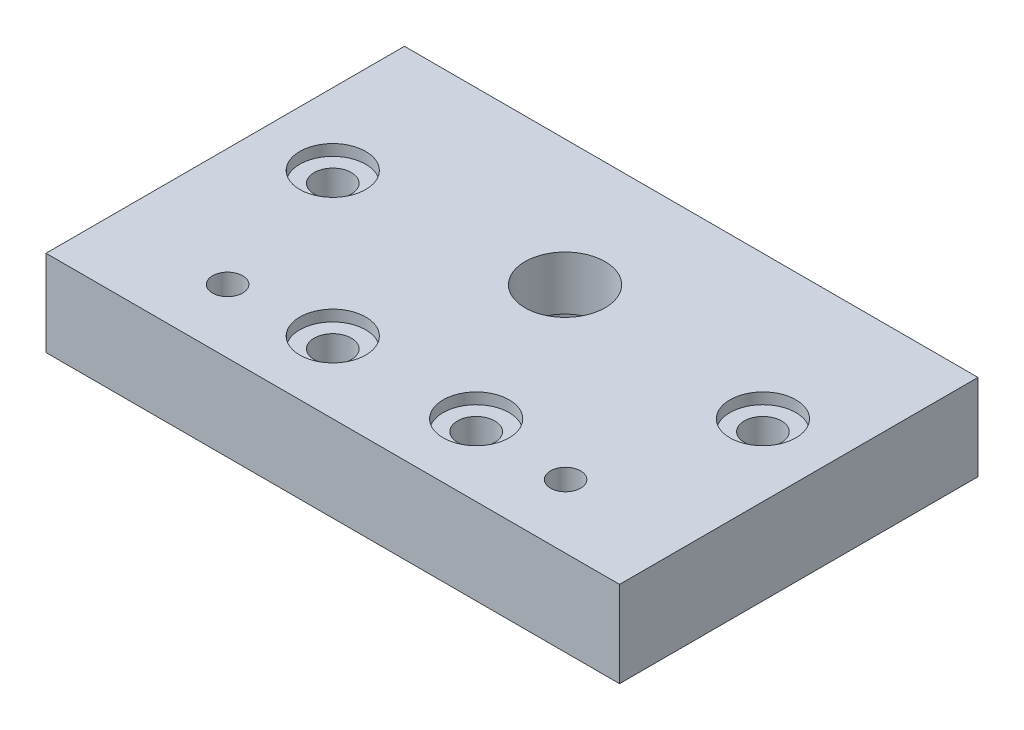
ISO-10303-21;
HEADER;
FILE_DESCRIPTION(('STEP AP214'),'2;1');
FILE_NAME('part.step','',(''),(''),'','','');
FILE_SCHEMA(('AUTOMOTIVE_DESIGN { 1 0 10303 214 1 1 1 1 }'));
ENDSEC;
DATA;
#1=APPLICATION_CONTEXT('core data for automotive mechanical design processes');
#2=APPLICATION_PROTOCOL_DEFINITION('international standard','automotive_design',2000,#1);
#3=PRODUCT_CONTEXT('',#1,'mechanical');
#4=PRODUCT('Part','Part','',(#3));
#5=PRODUCT_RELATED_PRODUCT_CATEGORY('part','',(#4));
#6=PRODUCT_DEFINITION_FORMATION('','',#4);
#7=PRODUCT_DEFINITION_CONTEXT('part definition',#1,'design');
#8=PRODUCT_DEFINITION('design','',#6,#7);
#9=PRODUCT_DEFINITION_SHAPE('','',#8);
#10=(LENGTH_UNIT() NAMED_UNIT(*) SI_UNIT(.MILLI.,.METRE.));
#11=(NAMED_UNIT(*) PLANE_ANGLE_UNIT() SI_UNIT($,.RADIAN.));
#12=(NAMED_UNIT(*) SI_UNIT($,.STERADIAN.) SOLID_ANGLE_UNIT());
#13=UNCERTAINTY_MEASURE_WITH_UNIT(LENGTH_MEASURE(1.E-05),#10,'distance_accuracy_value','');
#14=(GEOMETRIC_REPRESENTATION_CONTEXT(3) GLOBAL_UNCERTAINTY_ASSIGNED_CONTEXT((#13)) GLOBAL_UNIT_ASSIGNED_CONTEXT((#10,
#11,#12)) REPRESENTATION_CONTEXT('',''));
#15=CARTESIAN_POINT('',(0.,0.,0.));
#16=DIRECTION('',(0.,0.,1.));
#17=DIRECTION('',(1.,0.,0.));
#18=AXIS2_PLACEMENT_3D('',#15,#16,#17);
#19=CARTESIAN_POINT('',(0.,0.,0.));
#20=DIRECTION('',(0.,1.,0.));
#21=DIRECTION('',(0.,0.,1.));
#22=AXIS2_PLACEMENT_3D('',#19,#20,#21);
#23=PLANE('',#22);
#24=CARTESIAN_POINT('',(23.57,0.,16.1));
#25=DIRECTION('',(0.,1.,0.));
#26=DIRECTION('',(0.,0.,1.));
#27=AXIS2_PLACEMENT_3D('',#24,#25,#26);
#28=CIRCLE('',#27,2.09999999999999);
#29=CARTESIAN_POINT('',(23.57,0.,18.2));
#30=VERTEX_POINT('',#29);
#31=EDGE_CURVE('E128',#30,#30,#28,.T.);
#32=ORIENTED_EDGE('',*,*,#31,.T.);
#33=EDGE_LOOP('',(#32));
#34=FACE_BOUND('',#33,.T.);
#35=CARTESIAN_POINT('',(-23.57,0.,16.1));
#36=DIRECTION('',(0.,1.,0.));
#37=DIRECTION('',(0.,0.,1.));
#38=AXIS2_PLACEMENT_3D('',#35,#36,#37);
#39=CIRCLE('',#38,2.09999999999999);
#40=CARTESIAN_POINT('',(-23.57,0.,18.2));
#41=VERTEX_POINT('',#40);
#42=EDGE_CURVE('E134',#41,#41,#39,.T.);
#43=ORIENTED_EDGE('',*,*,#42,.T.);
#44=EDGE_LOOP('',(#43));
#45=FACE_BOUND('',#44,.T.);
#46=CARTESIAN_POINT('',(30.,0.,-5.));
#47=DIRECTION('',(0.,1.,0.));
#48=DIRECTION('',(0.,0.,1.));
#49=AXIS2_PLACEMENT_3D('',#46,#47,#48);
#50=CIRCLE('',#49,2.6);
#51=CARTESIAN_POINT('',(30.,0.,-2.4));
#52=VERTEX_POINT('',#51);
#53=EDGE_CURVE('E146',#52,#52,#50,.T.);
#54=ORIENTED_EDGE('',*,*,#53,.T.);
#55=EDGE_LOOP('',(#54));
#56=FACE_BOUND('',#55,.T.);
#57=CARTESIAN_POINT('',(10.,0.,15.));
#58=DIRECTION('',(0.,1.,0.));
#59=DIRECTION('',(0.,0.,1.));
#60=AXIS2_PLACEMENT_3D('',#57,#58,#59);
#61=CIRCLE('',#60,2.6);
#62=CARTESIAN_POINT('',(10.,0.,17.6));
#63=VERTEX_POINT('',#62);
#64=EDGE_CURVE('E158',#63,#63,#61,.T.);
#65=ORIENTED_EDGE('',*,*,#64,.T.);
#66=EDGE_LOOP('',(#65));
#67=FACE_BOUND('',#66,.T.);
#68=CARTESIAN_POINT('',(-30.,0.,-5.));
#69=DIRECTION('',(0.,1.,0.));
#70=DIRECTION('',(0.,0.,1.));
#71=AXIS2_PLACEMENT_3D('',#68,#69,#70);
#72=CIRCLE('',#71,2.6);
#73=CARTESIAN_POINT('',(-30.,0.,-2.4));
#74=VERTEX_POINT('',#73);
#75=EDGE_CURVE('E170',#74,#74,#72,.T.);
#76=ORIENTED_EDGE('',*,*,#75,.T.);
#77=EDGE_LOOP('',(#76));
#78=FACE_BOUND('',#77,.T.);
#79=CARTESIAN_POINT('',(-10.,0.,15.));
#80=DIRECTION('',(0.,1.,0.));
#81=DIRECTION('',(0.,0.,1.));
#82=AXIS2_PLACEMENT_3D('',#79,#80,#81);
#83=CIRCLE('',#82,2.6);
#84=CARTESIAN_POINT('',(-10.,0.,17.6));
#85=VERTEX_POINT('',#84);
#86=EDGE_CURVE('E182',#85,#85,#83,.T.);
#87=ORIENTED_EDGE('',*,*,#86,.T.);
#88=EDGE_LOOP('',(#87));
#89=FACE_BOUND('',#88,.T.);
#90=DIRECTION('',(0.,0.,-1.));
#91=VECTOR('',#90,1.);
#92=CARTESIAN_POINT('',(40.,0.,-25.));
#93=LINE('',#92,#91);
#94=CARTESIAN_POINT('',(40.,0.,25.));
#95=VERTEX_POINT('',#94);
#96=CARTESIAN_POINT('',(40.,0.,-25.));
#97=VERTEX_POINT('',#96);
#98=EDGE_CURVE('E185',#95,#97,#93,.T.);
#99=ORIENTED_EDGE('',*,*,#98,.F.);
#100=DIRECTION('',(1.,0.,0.));
#101=VECTOR('',#100,1.);
#102=CARTESIAN_POINT('',(-40.,0.,25.));
#103=LINE('',#102,#101);
#104=CARTESIAN_POINT('',(-40.,0.,25.));
#105=VERTEX_POINT('',#104);
#106=EDGE_CURVE('E78',#105,#95,#103,.T.);
#107=ORIENTED_EDGE('',*,*,#106,.F.);
#108=DIRECTION('',(0.,0.,1.));
#109=VECTOR('',#108,1.);
#110=CARTESIAN_POINT('',(-40.,0.,-25.));
#111=LINE('',#110,#109);
#112=CARTESIAN_POINT('',(-40.,0.,-25.));
#113=VERTEX_POINT('',#112);
#114=EDGE_CURVE('E72',#113,#105,#111,.T.);
#115=ORIENTED_EDGE('',*,*,#114,.F.);
#116=DIRECTION('',(-1.,0.,0.));
#117=VECTOR('',#116,1.);
#118=CARTESIAN_POINT('',(-40.,0.,-25.));
#119=LINE('',#118,#117);
#120=EDGE_CURVE('E195',#97,#113,#119,.T.);
#121=ORIENTED_EDGE('',*,*,#120,.F.);
#122=EDGE_LOOP('',(#99,#107,#115,#121));
#123=FACE_BOUND('',#122,.T.);
#124=CARTESIAN_POINT('',(0.,0.,-7.4));
#125=DIRECTION('',(0.,-1.,0.));
#126=DIRECTION('',(0.,0.,-1.));
#127=AXIS2_PLACEMENT_3D('',#124,#125,#126);
#128=CIRCLE('',#127,8.05);
#129=CARTESIAN_POINT('',(0.,0.,-15.45));
#130=VERTEX_POINT('',#129);
#131=EDGE_CURVE('E113',#130,#130,#128,.T.);
#132=ORIENTED_EDGE('',*,*,#131,.F.);
#133=EDGE_LOOP('',(#132));
#134=FACE_BOUND('',#133,.T.);
#135=ADVANCED_FACE('F37',(#34,#45,#56,#67,#78,#89,#123,#134),#23,.F.);
#136=CARTESIAN_POINT('',(40.,12.,-25.));
#137=DIRECTION('',(-1.,0.,0.));
#138=DIRECTION('',(0.,0.,1.));
#139=AXIS2_PLACEMENT_3D('',#136,#137,#138);
#140=PLANE('',#139);
#141=ORIENTED_EDGE('',*,*,#98,.T.);
#142=DIRECTION('',(0.,-1.,0.));
#143=VECTOR('',#142,1.);
#144=CARTESIAN_POINT('',(40.,12.,-25.));
#145=LINE('',#144,#143);
#146=CARTESIAN_POINT('',(40.,12.,-25.));
#147=VERTEX_POINT('',#146);
#148=EDGE_CURVE('E11',#147,#97,#145,.T.);
#149=ORIENTED_EDGE('',*,*,#148,.F.);
#150=DIRECTION('',(0.,0.,-1.));
#151=VECTOR('',#150,1.);
#152=CARTESIAN_POINT('',(40.,12.,-25.));
#153=LINE('',#152,#151);
#154=CARTESIAN_POINT('',(40.,12.,25.));
#155=VERTEX_POINT('',#154);
#156=EDGE_CURVE('E186',#155,#147,#153,.T.);
#157=ORIENTED_EDGE('',*,*,#156,.F.);
#158=DIRECTION('',(0.,-1.,0.));
#159=VECTOR('',#158,1.);
#160=CARTESIAN_POINT('',(40.,12.,25.));
#161=LINE('',#160,#159);
#162=EDGE_CURVE('E192',#155,#95,#161,.T.);
#163=ORIENTED_EDGE('',*,*,#162,.T.);
#164=EDGE_LOOP('',(#141,#149,#157,#163));
#165=FACE_BOUND('',#164,.T.);
#166=ADVANCED_FACE('F39',(#165),#140,.F.);
#167=CARTESIAN_POINT('',(-40.,12.,-25.));
#168=DIRECTION('',(0.,0.,1.));
#169=DIRECTION('',(1.,0.,0.));
#170=AXIS2_PLACEMENT_3D('',#167,#168,#169);
#171=PLANE('',#170);
#172=CARTESIAN_POINT('',(-9.99999999999999,6.,-25.));
#173=DIRECTION('',(0.,0.,-1.));
#174=DIRECTION('',(-1.,0.,0.));
#175=AXIS2_PLACEMENT_3D('',#172,#173,#174);
#176=CIRCLE('',#175,2.09999999999999);
#177=CARTESIAN_POINT('',(-12.1,6.,-25.));
#178=VERTEX_POINT('',#177);
#179=EDGE_CURVE('E103',#178,#178,#176,.T.);
#180=ORIENTED_EDGE('',*,*,#179,.F.);
#181=EDGE_LOOP('',(#180));
#182=FACE_BOUND('',#181,.T.);
#183=CARTESIAN_POINT('',(9.99999999999999,6.,-25.));
#184=DIRECTION('',(0.,0.,-1.));
#185=DIRECTION('',(-1.,0.,0.));
#186=AXIS2_PLACEMENT_3D('',#183,#184,#185);
#187=CIRCLE('',#186,2.09999999999999);
#188=CARTESIAN_POINT('',(7.9,6.,-25.));
#189=VERTEX_POINT('',#188);
#190=EDGE_CURVE('E102',#189,#189,#187,.T.);
#191=ORIENTED_EDGE('',*,*,#190,.F.);
#192=EDGE_LOOP('',(#191));
#193=FACE_BOUND('',#192,.T.);
#194=ORIENTED_EDGE('',*,*,#120,.T.);
#195=DIRECTION('',(0.,-1.,0.));
#196=VECTOR('',#195,1.);
#197=CARTESIAN_POINT('',(-40.,12.,-25.));
#198=LINE('',#197,#196);
#199=CARTESIAN_POINT('',(-40.,12.,-25.));
#200=VERTEX_POINT('',#199);
#201=EDGE_CURVE('E46',#200,#113,#198,.T.);
#202=ORIENTED_EDGE('',*,*,#201,.F.);
#203=DIRECTION('',(-1.,0.,0.));
#204=VECTOR('',#203,1.);
#205=CARTESIAN_POINT('',(-40.,12.,-25.));
#206=LINE('',#205,#204);
#207=EDGE_CURVE('E85',#147,#200,#206,.T.);
#208=ORIENTED_EDGE('',*,*,#207,.F.);
#209=ORIENTED_EDGE('',*,*,#148,.T.);
#210=EDGE_LOOP('',(#194,#202,#208,#209));
#211=FACE_BOUND('',#210,.T.);
#212=ADVANCED_FACE('F221',(#182,#193,#211),#171,.F.);
#213=CARTESIAN_POINT('',(-40.,12.,-25.));
#214=DIRECTION('',(1.,0.,0.));
#215=DIRECTION('',(0.,0.,-1.));
#216=AXIS2_PLACEMENT_3D('',#213,#214,#215);
#217=PLANE('',#216);
#218=ORIENTED_EDGE('',*,*,#114,.T.);
#219=DIRECTION('',(0.,-1.,0.));
#220=VECTOR('',#219,1.);
#221=CARTESIAN_POINT('',(-40.,12.,25.));
#222=LINE('',#221,#220);
#223=CARTESIAN_POINT('',(-40.,12.,25.));
#224=VERTEX_POINT('',#223);
#225=EDGE_CURVE('E200',#224,#105,#222,.T.);
#226=ORIENTED_EDGE('',*,*,#225,.F.);
#227=DIRECTION('',(0.,0.,1.));
#228=VECTOR('',#227,1.);
#229=CARTESIAN_POINT('',(-40.,12.,-25.));
#230=LINE('',#229,#228);
#231=EDGE_CURVE('E189',#200,#224,#230,.T.);
#232=ORIENTED_EDGE('',*,*,#231,.F.);
#233=ORIENTED_EDGE('',*,*,#201,.T.);
#234=EDGE_LOOP('',(#218,#226,#232,#233));
#235=FACE_BOUND('',#234,.T.);
#236=ADVANCED_FACE('F202',(#235),#217,.F.);
#237=CARTESIAN_POINT('',(-40.,12.,25.));
#238=DIRECTION('',(0.,0.,-1.));
#239=DIRECTION('',(-1.,0.,0.));
#240=AXIS2_PLACEMENT_3D('',#237,#238,#239);
#241=PLANE('',#240);
#242=ORIENTED_EDGE('',*,*,#106,.T.);
#243=ORIENTED_EDGE('',*,*,#162,.F.);
#244=DIRECTION('',(1.,0.,0.));
#245=VECTOR('',#244,1.);
#246=CARTESIAN_POINT('',(-40.,12.,25.));
#247=LINE('',#246,#245);
#248=EDGE_CURVE('E54',#224,#155,#247,.T.);
#249=ORIENTED_EDGE('',*,*,#248,.F.);
#250=ORIENTED_EDGE('',*,*,#225,.T.);
#251=EDGE_LOOP('',(#242,#243,#249,#250));
#252=FACE_BOUND('',#251,.T.);
#253=ADVANCED_FACE('F209',(#252),#241,.F.);
#254=CARTESIAN_POINT('',(0.,12.,0.));
#255=DIRECTION('',(0.,1.,0.));
#256=DIRECTION('',(0.,0.,1.));
#257=AXIS2_PLACEMENT_3D('',#254,#255,#256);
#258=PLANE('',#257);
#259=CARTESIAN_POINT('',(0.,12.,-7.4));
#260=DIRECTION('',(0.,-1.,0.));
#261=DIRECTION('',(0.,0.,-1.));
#262=AXIS2_PLACEMENT_3D('',#259,#260,#261);
#263=CIRCLE('',#262,5.58800000000001);
#264=CARTESIAN_POINT('',(0.,12.,-12.988));
#265=VERTEX_POINT('',#264);
#266=EDGE_CURVE('E122',#265,#265,#263,.T.);
#267=ORIENTED_EDGE('',*,*,#266,.T.);
#268=EDGE_LOOP('',(#267));
#269=FACE_BOUND('',#268,.T.);
#270=CARTESIAN_POINT('',(23.57,12.,16.1));
#271=DIRECTION('',(0.,1.,0.));
#272=DIRECTION('',(0.,0.,1.));
#273=AXIS2_PLACEMENT_3D('',#270,#271,#272);
#274=CIRCLE('',#273,2.09999999999999);
#275=CARTESIAN_POINT('',(23.57,12.,18.2));
#276=VERTEX_POINT('',#275);
#277=EDGE_CURVE('E125',#276,#276,#274,.T.);
#278=ORIENTED_EDGE('',*,*,#277,.F.);
#279=EDGE_LOOP('',(#278));
#280=FACE_BOUND('',#279,.T.);
#281=CARTESIAN_POINT('',(-23.57,12.,16.1));
#282=DIRECTION('',(0.,1.,0.));
#283=DIRECTION('',(0.,0.,1.));
#284=AXIS2_PLACEMENT_3D('',#281,#282,#283);
#285=CIRCLE('',#284,2.09999999999999);
#286=CARTESIAN_POINT('',(-23.57,12.,18.2));
#287=VERTEX_POINT('',#286);
#288=EDGE_CURVE('E131',#287,#287,#285,.T.);
#289=ORIENTED_EDGE('',*,*,#288,.F.);
#290=EDGE_LOOP('',(#289));
#291=FACE_BOUND('',#290,.T.);
#292=CARTESIAN_POINT('',(30.,12.,-5.));
#293=DIRECTION('',(0.,1.,0.));
#294=DIRECTION('',(0.,0.,1.));
#295=AXIS2_PLACEMENT_3D('',#292,#293,#294);
#296=CIRCLE('',#295,4.6);
#297=CARTESIAN_POINT('',(30.,12.,-0.400000000000001));
#298=VERTEX_POINT('',#297);
#299=EDGE_CURVE('E137',#298,#298,#296,.T.);
#300=ORIENTED_EDGE('',*,*,#299,.F.);
#301=EDGE_LOOP('',(#300));
#302=FACE_BOUND('',#301,.T.);
#303=CARTESIAN_POINT('',(10.,12.,15.));
#304=DIRECTION('',(0.,1.,0.));
#305=DIRECTION('',(0.,0.,1.));
#306=AXIS2_PLACEMENT_3D('',#303,#304,#305);
#307=CIRCLE('',#306,4.6);
#308=CARTESIAN_POINT('',(10.,12.,19.6));
#309=VERTEX_POINT('',#308);
#310=EDGE_CURVE('E149',#309,#309,#307,.T.);
#311=ORIENTED_EDGE('',*,*,#310,.F.);
#312=EDGE_LOOP('',(#311));
#313=FACE_BOUND('',#312,.T.);
#314=CARTESIAN_POINT('',(-30.,12.,-5.));
#315=DIRECTION('',(0.,1.,0.));
#316=DIRECTION('',(0.,0.,1.));
#317=AXIS2_PLACEMENT_3D('',#314,#315,#316);
#318=CIRCLE('',#317,4.6);
#319=CARTESIAN_POINT('',(-30.,12.,-0.400000000000001));
#320=VERTEX_POINT('',#319);
#321=EDGE_CURVE('E161',#320,#320,#318,.T.);
#322=ORIENTED_EDGE('',*,*,#321,.F.);
#323=EDGE_LOOP('',(#322));
#324=FACE_BOUND('',#323,.T.);
#325=CARTESIAN_POINT('',(-10.,12.,15.));
#326=DIRECTION('',(0.,1.,0.));
#327=DIRECTION('',(0.,0.,1.));
#328=AXIS2_PLACEMENT_3D('',#325,#326,#327);
#329=CIRCLE('',#328,4.6);
#330=CARTESIAN_POINT('',(-10.,12.,19.6));
#331=VERTEX_POINT('',#330);
#332=EDGE_CURVE('E173',#331,#331,#329,.T.);
#333=ORIENTED_EDGE('',*,*,#332,.F.);
#334=EDGE_LOOP('',(#333));
#335=FACE_BOUND('',#334,.T.);
#336=ORIENTED_EDGE('',*,*,#156,.T.);
#337=ORIENTED_EDGE('',*,*,#207,.T.);
#338=ORIENTED_EDGE('',*,*,#231,.T.);
#339=ORIENTED_EDGE('',*,*,#248,.T.);
#340=EDGE_LOOP('',(#336,#337,#338,#339));
#341=FACE_BOUND('',#340,.T.);
#342=ADVANCED_FACE('F211',(#269,#280,#291,#302,#313,#324,#335,#341),#258,.T.);
#343=CARTESIAN_POINT('',(-10.,12.,15.));
#344=DIRECTION('',(0.,1.,0.));
#345=DIRECTION('',(0.,0.,1.));
#346=AXIS2_PLACEMENT_3D('',#343,#344,#345);
#347=CYLINDRICAL_SURFACE('',#346,2.6);
#348=ORIENTED_EDGE('',*,*,#86,.F.);
#349=EDGE_LOOP('',(#348));
#350=FACE_BOUND('',#349,.T.);
#351=CARTESIAN_POINT('',(-10.,10.45,15.));
#352=DIRECTION('',(0.,1.,0.));
#353=DIRECTION('',(0.,0.,1.));
#354=AXIS2_PLACEMENT_3D('',#351,#352,#353);
#355=CIRCLE('',#354,2.6);
#356=CARTESIAN_POINT('',(-10.,10.45,17.6));
#357=VERTEX_POINT('',#356);
#358=EDGE_CURVE('E179',#357,#357,#355,.T.);
#359=ORIENTED_EDGE('',*,*,#358,.T.);
#360=EDGE_LOOP('',(#359));
#361=FACE_BOUND('',#360,.T.);
#362=ADVANCED_FACE('F218',(#350,#361),#347,.F.);
#363=CARTESIAN_POINT('',(-7.40000000000001,10.45,15.));
#364=DIRECTION('',(0.,-1.,0.));
#365=DIRECTION('',(0.,0.,-1.));
#366=AXIS2_PLACEMENT_3D('',#363,#364,#365);
#367=PLANE('',#366);
#368=ORIENTED_EDGE('',*,*,#358,.F.);
#369=EDGE_LOOP('',(#368));
#370=FACE_BOUND('',#369,.T.);
#371=CARTESIAN_POINT('',(-10.,10.45,15.));
#372=DIRECTION('',(0.,1.,0.));
#373=DIRECTION('',(0.,0.,1.));
#374=AXIS2_PLACEMENT_3D('',#371,#372,#373);
#375=CIRCLE('',#374,4.6);
#376=CARTESIAN_POINT('',(-10.,10.45,19.6));
#377=VERTEX_POINT('',#376);
#378=EDGE_CURVE('E176',#377,#377,#375,.T.);
#379=ORIENTED_EDGE('',*,*,#378,.T.);
#380=EDGE_LOOP('',(#379));
#381=FACE_BOUND('',#380,.T.);
#382=ADVANCED_FACE('F233',(#370,#381),#367,.F.);
#383=CARTESIAN_POINT('',(-10.,12.,15.));
#384=DIRECTION('',(0.,1.,0.));
#385=DIRECTION('',(0.,0.,1.));
#386=AXIS2_PLACEMENT_3D('',#383,#384,#385);
#387=CYLINDRICAL_SURFACE('',#386,4.6);
#388=ORIENTED_EDGE('',*,*,#378,.F.);
#389=EDGE_LOOP('',(#388));
#390=FACE_BOUND('',#389,.T.);
#391=ORIENTED_EDGE('',*,*,#332,.T.);
#392=EDGE_LOOP('',(#391));
#393=FACE_BOUND('',#392,.T.);
#394=ADVANCED_FACE('F237',(#390,#393),#387,.F.);
#395=CARTESIAN_POINT('',(-30.,12.,-5.));
#396=DIRECTION('',(0.,1.,0.));
#397=DIRECTION('',(0.,0.,1.));
#398=AXIS2_PLACEMENT_3D('',#395,#396,#397);
#399=CYLINDRICAL_SURFACE('',#398,2.6);
#400=ORIENTED_EDGE('',*,*,#75,.F.);
#401=EDGE_LOOP('',(#400));
#402=FACE_BOUND('',#401,.T.);
#403=CARTESIAN_POINT('',(-30.,10.45,-5.));
#404=DIRECTION('',(0.,1.,0.));
#405=DIRECTION('',(0.,0.,1.));
#406=AXIS2_PLACEMENT_3D('',#403,#404,#405);
#407=CIRCLE('',#406,2.6);
#408=CARTESIAN_POINT('',(-30.,10.45,-2.4));
#409=VERTEX_POINT('',#408);
#410=EDGE_CURVE('E167',#409,#409,#407,.T.);
#411=ORIENTED_EDGE('',*,*,#410,.T.);
#412=EDGE_LOOP('',(#411));
#413=FACE_BOUND('',#412,.T.);
#414=ADVANCED_FACE('F241',(#402,#413),#399,.F.);
#415=CARTESIAN_POINT('',(-27.4,10.45,-5.));
#416=DIRECTION('',(0.,-1.,0.));
#417=DIRECTION('',(0.,0.,-1.));
#418=AXIS2_PLACEMENT_3D('',#415,#416,#417);
#419=PLANE('',#418);
#420=ORIENTED_EDGE('',*,*,#410,.F.);
#421=EDGE_LOOP('',(#420));
#422=FACE_BOUND('',#421,.T.);
#423=CARTESIAN_POINT('',(-30.,10.45,-5.));
#424=DIRECTION('',(0.,1.,0.));
#425=DIRECTION('',(0.,0.,1.));
#426=AXIS2_PLACEMENT_3D('',#423,#424,#425);
#427=CIRCLE('',#426,4.6);
#428=CARTESIAN_POINT('',(-30.,10.45,-0.400000000000001));
#429=VERTEX_POINT('',#428);
#430=EDGE_CURVE('E164',#429,#429,#427,.T.);
#431=ORIENTED_EDGE('',*,*,#430,.T.);
#432=EDGE_LOOP('',(#431));
#433=FACE_BOUND('',#432,.T.);
#434=ADVANCED_FACE('F245',(#422,#433),#419,.F.);
#435=CARTESIAN_POINT('',(-30.,12.,-5.));
#436=DIRECTION('',(0.,1.,0.));
#437=DIRECTION('',(0.,0.,1.));
#438=AXIS2_PLACEMENT_3D('',#435,#436,#437);
#439=CYLINDRICAL_SURFACE('',#438,4.6);
#440=ORIENTED_EDGE('',*,*,#430,.F.);
#441=EDGE_LOOP('',(#440));
#442=FACE_BOUND('',#441,.T.);
#443=ORIENTED_EDGE('',*,*,#321,.T.);
#444=EDGE_LOOP('',(#443));
#445=FACE_BOUND('',#444,.T.);
#446=ADVANCED_FACE('F249',(#442,#445),#439,.F.);
#447=CARTESIAN_POINT('',(10.,12.,15.));
#448=DIRECTION('',(0.,1.,0.));
#449=DIRECTION('',(0.,0.,1.));
#450=AXIS2_PLACEMENT_3D('',#447,#448,#449);
#451=CYLINDRICAL_SURFACE('',#450,2.6);
#452=ORIENTED_EDGE('',*,*,#64,.F.);
#453=EDGE_LOOP('',(#452));
#454=FACE_BOUND('',#453,.T.);
#455=CARTESIAN_POINT('',(10.,10.45,15.));
#456=DIRECTION('',(0.,1.,0.));
#457=DIRECTION('',(0.,0.,1.));
#458=AXIS2_PLACEMENT_3D('',#455,#456,#457);
#459=CIRCLE('',#458,2.6);
#460=CARTESIAN_POINT('',(10.,10.45,17.6));
#461=VERTEX_POINT('',#460);
#462=EDGE_CURVE('E155',#461,#461,#459,.T.);
#463=ORIENTED_EDGE('',*,*,#462,.T.);
#464=EDGE_LOOP('',(#463));
#465=FACE_BOUND('',#464,.T.);
#466=ADVANCED_FACE('F253',(#454,#465),#451,.F.);
#467=CARTESIAN_POINT('',(12.6,10.45,15.));
#468=DIRECTION('',(0.,-1.,0.));
#469=DIRECTION('',(0.,0.,-1.));
#470=AXIS2_PLACEMENT_3D('',#467,#468,#469);
#471=PLANE('',#470);
#472=ORIENTED_EDGE('',*,*,#462,.F.);
#473=EDGE_LOOP('',(#472));
#474=FACE_BOUND('',#473,.T.);
#475=CARTESIAN_POINT('',(10.,10.45,15.));
#476=DIRECTION('',(0.,1.,0.));
#477=DIRECTION('',(0.,0.,1.));
#478=AXIS2_PLACEMENT_3D('',#475,#476,#477);
#479=CIRCLE('',#478,4.6);
#480=CARTESIAN_POINT('',(10.,10.45,19.6));
#481=VERTEX_POINT('',#480);
#482=EDGE_CURVE('E152',#481,#481,#479,.T.);
#483=ORIENTED_EDGE('',*,*,#482,.T.);
#484=EDGE_LOOP('',(#483));
#485=FACE_BOUND('',#484,.T.);
#486=ADVANCED_FACE('F257',(#474,#485),#471,.F.);
#487=CARTESIAN_POINT('',(10.,12.,15.));
#488=DIRECTION('',(0.,1.,0.));
#489=DIRECTION('',(0.,0.,1.));
#490=AXIS2_PLACEMENT_3D('',#487,#488,#489);
#491=CYLINDRICAL_SURFACE('',#490,4.6);
#492=ORIENTED_EDGE('',*,*,#482,.F.);
#493=EDGE_LOOP('',(#492));
#494=FACE_BOUND('',#493,.T.);
#495=ORIENTED_EDGE('',*,*,#310,.T.);
#496=EDGE_LOOP('',(#495));
#497=FACE_BOUND('',#496,.T.);
#498=ADVANCED_FACE('F261',(#494,#497),#491,.F.);
#499=CARTESIAN_POINT('',(30.,12.,-5.));
#500=DIRECTION('',(0.,1.,0.));
#501=DIRECTION('',(0.,0.,1.));
#502=AXIS2_PLACEMENT_3D('',#499,#500,#501);
#503=CYLINDRICAL_SURFACE('',#502,2.6);
#504=ORIENTED_EDGE('',*,*,#53,.F.);
#505=EDGE_LOOP('',(#504));
#506=FACE_BOUND('',#505,.T.);
#507=CARTESIAN_POINT('',(30.,10.45,-5.));
#508=DIRECTION('',(0.,1.,0.));
#509=DIRECTION('',(0.,0.,1.));
#510=AXIS2_PLACEMENT_3D('',#507,#508,#509);
#511=CIRCLE('',#510,2.6);
#512=CARTESIAN_POINT('',(30.,10.45,-2.4));
#513=VERTEX_POINT('',#512);
#514=EDGE_CURVE('E143',#513,#513,#511,.T.);
#515=ORIENTED_EDGE('',*,*,#514,.T.);
#516=EDGE_LOOP('',(#515));
#517=FACE_BOUND('',#516,.T.);
#518=ADVANCED_FACE('F265',(#506,#517),#503,.F.);
#519=CARTESIAN_POINT('',(32.6,10.45,-5.));
#520=DIRECTION('',(0.,-1.,0.));
#521=DIRECTION('',(0.,0.,-1.));
#522=AXIS2_PLACEMENT_3D('',#519,#520,#521);
#523=PLANE('',#522);
#524=ORIENTED_EDGE('',*,*,#514,.F.);
#525=EDGE_LOOP('',(#524));
#526=FACE_BOUND('',#525,.T.);
#527=CARTESIAN_POINT('',(30.,10.45,-5.));
#528=DIRECTION('',(0.,1.,0.));
#529=DIRECTION('',(0.,0.,1.));
#530=AXIS2_PLACEMENT_3D('',#527,#528,#529);
#531=CIRCLE('',#530,4.6);
#532=CARTESIAN_POINT('',(30.,10.45,-0.400000000000001));
#533=VERTEX_POINT('',#532);
#534=EDGE_CURVE('E140',#533,#533,#531,.T.);
#535=ORIENTED_EDGE('',*,*,#534,.T.);
#536=EDGE_LOOP('',(#535));
#537=FACE_BOUND('',#536,.T.);
#538=ADVANCED_FACE('F269',(#526,#537),#523,.F.);
#539=CARTESIAN_POINT('',(30.,12.,-5.));
#540=DIRECTION('',(0.,1.,0.));
#541=DIRECTION('',(0.,0.,1.));
#542=AXIS2_PLACEMENT_3D('',#539,#540,#541);
#543=CYLINDRICAL_SURFACE('',#542,4.6);
#544=ORIENTED_EDGE('',*,*,#534,.F.);
#545=EDGE_LOOP('',(#544));
#546=FACE_BOUND('',#545,.T.);
#547=ORIENTED_EDGE('',*,*,#299,.T.);
#548=EDGE_LOOP('',(#547));
#549=FACE_BOUND('',#548,.T.);
#550=ADVANCED_FACE('F273',(#546,#549),#543,.F.);
#551=CARTESIAN_POINT('',(-23.57,12.,16.1));
#552=DIRECTION('',(0.,1.,0.));
#553=DIRECTION('',(0.,0.,1.));
#554=AXIS2_PLACEMENT_3D('',#551,#552,#553);
#555=CYLINDRICAL_SURFACE('',#554,2.09999999999999);
#556=ORIENTED_EDGE('',*,*,#42,.F.);
#557=EDGE_LOOP('',(#556));
#558=FACE_BOUND('',#557,.T.);
#559=ORIENTED_EDGE('',*,*,#288,.T.);
#560=EDGE_LOOP('',(#559));
#561=FACE_BOUND('',#560,.T.);
#562=ADVANCED_FACE('F277',(#558,#561),#555,.F.);
#563=CARTESIAN_POINT('',(23.57,12.,16.1));
#564=DIRECTION('',(0.,1.,0.));
#565=DIRECTION('',(0.,0.,1.));
#566=AXIS2_PLACEMENT_3D('',#563,#564,#565);
#567=CYLINDRICAL_SURFACE('',#566,2.09999999999999);
#568=ORIENTED_EDGE('',*,*,#31,.F.);
#569=EDGE_LOOP('',(#568));
#570=FACE_BOUND('',#569,.T.);
#571=ORIENTED_EDGE('',*,*,#277,.T.);
#572=EDGE_LOOP('',(#571));
#573=FACE_BOUND('',#572,.T.);
#574=ADVANCED_FACE('F281',(#570,#573),#567,.F.);
#575=CARTESIAN_POINT('',(0.,0.,-7.4));
#576=DIRECTION('',(0.,-1.,0.));
#577=DIRECTION('',(0.,0.,-1.));
#578=AXIS2_PLACEMENT_3D('',#575,#576,#577);
#579=CYLINDRICAL_SURFACE('',#578,5.58800000000001);
#580=ORIENTED_EDGE('',*,*,#266,.F.);
#581=EDGE_LOOP('',(#580));
#582=FACE_BOUND('',#581,.T.);
#583=CARTESIAN_POINT('',(0.,4.5,-7.4));
#584=DIRECTION('',(0.,-1.,0.));
#585=DIRECTION('',(0.,0.,-1.));
#586=AXIS2_PLACEMENT_3D('',#583,#584,#585);
#587=CIRCLE('',#586,5.58800000000001);
#588=CARTESIAN_POINT('',(0.,4.5,-12.988));
#589=VERTEX_POINT('',#588);
#590=EDGE_CURVE('E119',#589,#589,#587,.T.);
#591=ORIENTED_EDGE('',*,*,#590,.T.);
#592=EDGE_LOOP('',(#591));
#593=FACE_BOUND('',#592,.T.);
#594=ADVANCED_FACE('F284',(#582,#593),#579,.F.);
#595=CARTESIAN_POINT('',(5.58800000000001,4.5,-7.4));
#596=DIRECTION('',(0.,1.,0.));
#597=DIRECTION('',(0.,0.,1.));
#598=AXIS2_PLACEMENT_3D('',#595,#596,#597);
#599=PLANE('',#598);
#600=ORIENTED_EDGE('',*,*,#590,.F.);
#601=EDGE_LOOP('',(#600));
#602=FACE_BOUND('',#601,.T.);
#603=CARTESIAN_POINT('',(0.,4.5,-7.4));
#604=DIRECTION('',(0.,-1.,0.));
#605=DIRECTION('',(0.,0.,-1.));
#606=AXIS2_PLACEMENT_3D('',#603,#604,#605);
#607=CIRCLE('',#606,8.05);
#608=CARTESIAN_POINT('',(0.,4.5,-15.45));
#609=VERTEX_POINT('',#608);
#610=EDGE_CURVE('E116',#609,#609,#607,.T.);
#611=ORIENTED_EDGE('',*,*,#610,.T.);
#612=EDGE_LOOP('',(#611));
#613=FACE_BOUND('',#612,.T.);
#614=ADVANCED_FACE('F288',(#602,#613),#599,.F.);
#615=CARTESIAN_POINT('',(0.,0.,-7.4));
#616=DIRECTION('',(0.,-1.,0.));
#617=DIRECTION('',(0.,0.,-1.));
#618=AXIS2_PLACEMENT_3D('',#615,#616,#617);
#619=CYLINDRICAL_SURFACE('',#618,8.05);
#620=ORIENTED_EDGE('',*,*,#610,.F.);
#621=EDGE_LOOP('',(#620));
#622=FACE_BOUND('',#621,.T.);
#623=ORIENTED_EDGE('',*,*,#131,.T.);
#624=EDGE_LOOP('',(#623));
#625=FACE_BOUND('',#624,.T.);
#626=ADVANCED_FACE('F292',(#622,#625),#619,.F.);
#627=CARTESIAN_POINT('',(9.99999999999999,6.,-11.));
#628=DIRECTION('',(0.,0.,-1.));
#629=DIRECTION('',(-1.,0.,0.));
#630=AXIS2_PLACEMENT_3D('',#627,#628,#629);
#631=CONICAL_SURFACE('',#630,2.1,1.02974425867665);
#632=CARTESIAN_POINT('',(9.99999999999998,6.,-9.73819270004213));
#633=VERTEX_POINT('',#632);
#634=VERTEX_LOOP('',#633);
#635=FACE_BOUND('',#634,.T.);
#636=CARTESIAN_POINT('',(9.99999999999999,6.,-11.));
#637=DIRECTION('',(0.,0.,-1.));
#638=DIRECTION('',(-1.,0.,0.));
#639=AXIS2_PLACEMENT_3D('',#636,#637,#638);
#640=CIRCLE('',#639,2.1);
#641=CARTESIAN_POINT('',(7.89999999999999,6.,-11.));
#642=VERTEX_POINT('',#641);
#643=EDGE_CURVE('E106',#642,#642,#640,.T.);
#644=ORIENTED_EDGE('',*,*,#643,.T.);
#645=EDGE_LOOP('',(#644));
#646=FACE_BOUND('',#645,.T.);
#647=ADVANCED_FACE('F296',(#635,#646),#631,.F.);
#648=CARTESIAN_POINT('',(9.99999999999999,6.,-25.));
#649=DIRECTION('',(0.,0.,-1.));
#650=DIRECTION('',(-1.,0.,0.));
#651=AXIS2_PLACEMENT_3D('',#648,#649,#650);
#652=CYLINDRICAL_SURFACE('',#651,2.09999999999999);
#653=ORIENTED_EDGE('',*,*,#643,.F.);
#654=EDGE_LOOP('',(#653));
#655=FACE_BOUND('',#654,.T.);
#656=ORIENTED_EDGE('',*,*,#190,.T.);
#657=EDGE_LOOP('',(#656));
#658=FACE_BOUND('',#657,.T.);
#659=ADVANCED_FACE('F96',(#655,#658),#652,.F.);
#660=CARTESIAN_POINT('',(-9.99999999999999,6.,-11.));
#661=DIRECTION('',(0.,0.,-1.));
#662=DIRECTION('',(-1.,0.,0.));
#663=AXIS2_PLACEMENT_3D('',#660,#661,#662);
#664=CONICAL_SURFACE('',#663,2.1,1.02974425867665);
#665=CARTESIAN_POINT('',(-9.99999999999999,6.,-9.73819270004213));
#666=VERTEX_POINT('',#665);
#667=VERTEX_LOOP('',#666);
#668=FACE_BOUND('',#667,.T.);
#669=CARTESIAN_POINT('',(-9.99999999999999,6.,-11.));
#670=DIRECTION('',(0.,0.,-1.));
#671=DIRECTION('',(-1.,0.,0.));
#672=AXIS2_PLACEMENT_3D('',#669,#670,#671);
#673=CIRCLE('',#672,2.1);
#674=CARTESIAN_POINT('',(-12.1,6.,-11.));
#675=VERTEX_POINT('',#674);
#676=EDGE_CURVE('E100',#675,#675,#673,.T.);
#677=ORIENTED_EDGE('',*,*,#676,.T.);
#678=EDGE_LOOP('',(#677));
#679=FACE_BOUND('',#678,.T.);
#680=ADVANCED_FACE('F92',(#668,#679),#664,.F.);
#681=CARTESIAN_POINT('',(-9.99999999999999,6.,-25.));
#682=DIRECTION('',(0.,0.,-1.));
#683=DIRECTION('',(-1.,0.,0.));
#684=AXIS2_PLACEMENT_3D('',#681,#682,#683);
#685=CYLINDRICAL_SURFACE('',#684,2.09999999999999);
#686=ORIENTED_EDGE('',*,*,#676,.F.);
#687=EDGE_LOOP('',(#686));
#688=FACE_BOUND('',#687,.T.);
#689=ORIENTED_EDGE('',*,*,#179,.T.);
#690=EDGE_LOOP('',(#689));
#691=FACE_BOUND('',#690,.T.);
#692=ADVANCED_FACE('F95',(#688,#691),#685,.F.);
#693=CLOSED_SHELL('',(#135,#166,#212,#236,#253,#342,#362,#382,#394,#414,#434,#446,#466,#486,
#498,#518,#538,#550,#562,#574,#594,#614,#626,#647,#659,#680,#692));
#694=MANIFOLD_SOLID_BREP('B2',#693);
#695=ADVANCED_BREP_SHAPE_REPRESENTATION('',(#18,#694),#14);
#696=SHAPE_DEFINITION_REPRESENTATION(#9,#695);
ENDSEC;
END-ISO-10303-21;
